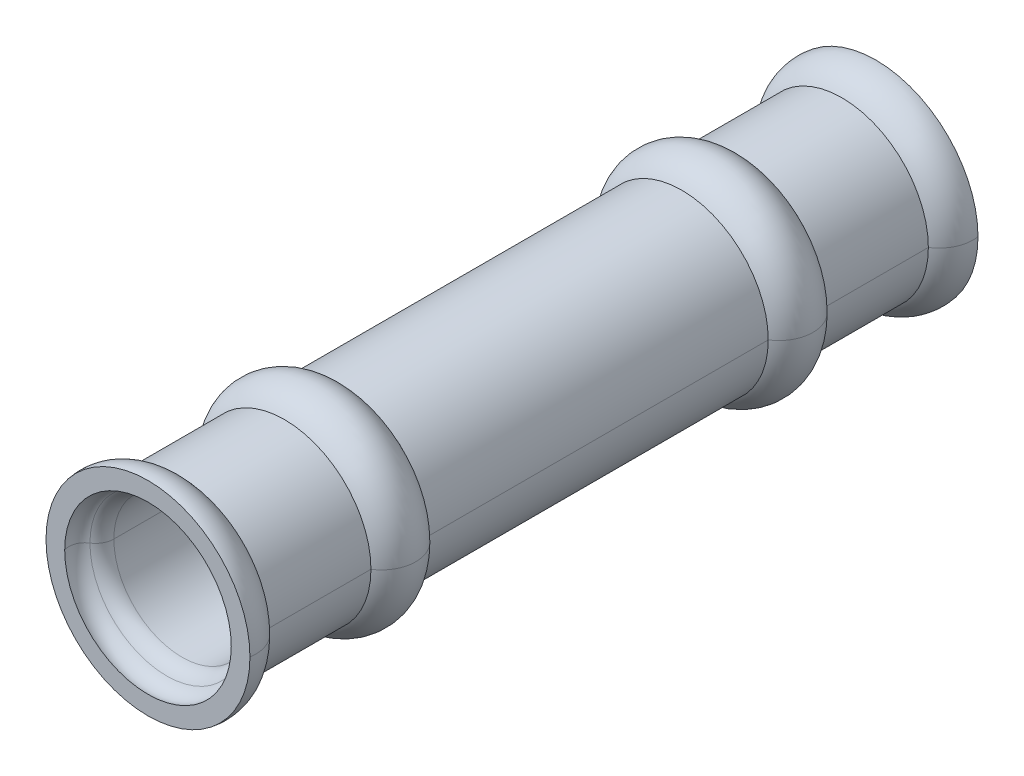
ISO-10303-21;
HEADER;
FILE_DESCRIPTION(('STEP AP214'),'2;1');
FILE_NAME('part.step','',(''),(''),'','','');
FILE_SCHEMA(('AUTOMOTIVE_DESIGN { 1 0 10303 214 1 1 1 1 }'));
ENDSEC;
DATA;
#1=APPLICATION_CONTEXT('core data for automotive mechanical design processes');
#2=APPLICATION_PROTOCOL_DEFINITION('international standard','automotive_design',2000,#1);
#3=PRODUCT_CONTEXT('',#1,'mechanical');
#4=PRODUCT('Part','Part','',(#3));
#5=PRODUCT_RELATED_PRODUCT_CATEGORY('part','',(#4));
#6=PRODUCT_DEFINITION_FORMATION('','',#4);
#7=PRODUCT_DEFINITION_CONTEXT('part definition',#1,'design');
#8=PRODUCT_DEFINITION('design','',#6,#7);
#9=PRODUCT_DEFINITION_SHAPE('','',#8);
#10=(LENGTH_UNIT() NAMED_UNIT(*) SI_UNIT(.MILLI.,.METRE.));
#11=(NAMED_UNIT(*) PLANE_ANGLE_UNIT() SI_UNIT($,.RADIAN.));
#12=(NAMED_UNIT(*) SI_UNIT($,.STERADIAN.) SOLID_ANGLE_UNIT());
#13=UNCERTAINTY_MEASURE_WITH_UNIT(LENGTH_MEASURE(1.E-05),#10,'distance_accuracy_value','');
#14=(GEOMETRIC_REPRESENTATION_CONTEXT(3) GLOBAL_UNCERTAINTY_ASSIGNED_CONTEXT((#13)) GLOBAL_UNIT_ASSIGNED_CONTEXT((#10,
#11,#12)) REPRESENTATION_CONTEXT('',''));
#15=CARTESIAN_POINT('',(0.,0.,0.));
#16=DIRECTION('',(0.,0.,1.));
#17=DIRECTION('',(1.,0.,0.));
#18=AXIS2_PLACEMENT_3D('',#15,#16,#17);
#19=CARTESIAN_POINT('',(0.,0.,-27.6));
#20=DIRECTION('',(0.,0.,-1.));
#21=DIRECTION('',(-1.,0.,0.));
#22=AXIS2_PLACEMENT_3D('',#19,#20,#21);
#23=CYLINDRICAL_SURFACE('',#22,3.);
#24=CARTESIAN_POINT('',(0.,0.,-2.53771550808997));
#25=DIRECTION('',(0.,0.,1.));
#26=DIRECTION('',(1.,0.,0.));
#27=AXIS2_PLACEMENT_3D('',#24,#25,#26);
#28=CIRCLE('',#27,3.);
#29=CARTESIAN_POINT('',(3.,0.,-2.53771550808997));
#30=VERTEX_POINT('',#29);
#31=CARTESIAN_POINT('',(-3.,0.,-2.53771550808997));
#32=VERTEX_POINT('',#31);
#33=EDGE_CURVE('E9',#30,#32,#28,.T.);
#34=ORIENTED_EDGE('',*,*,#33,.T.);
#35=DIRECTION('',(0.,0.,1.));
#36=VECTOR('',#35,1.);
#37=CARTESIAN_POINT('',(-3.,0.,-17.46228449191));
#38=LINE('',#37,#36);
#39=CARTESIAN_POINT('',(-3.,0.,-17.46228449191));
#40=VERTEX_POINT('',#39);
#41=EDGE_CURVE('E244',#40,#32,#38,.T.);
#42=ORIENTED_EDGE('',*,*,#41,.F.);
#43=CARTESIAN_POINT('',(0.,0.,-17.46228449191));
#44=DIRECTION('',(0.,0.,1.));
#45=DIRECTION('',(1.,0.,0.));
#46=AXIS2_PLACEMENT_3D('',#43,#44,#45);
#47=CIRCLE('',#46,3.);
#48=CARTESIAN_POINT('',(3.,0.,-17.46228449191));
#49=VERTEX_POINT('',#48);
#50=EDGE_CURVE('E242',#49,#40,#47,.T.);
#51=ORIENTED_EDGE('',*,*,#50,.F.);
#52=DIRECTION('',(0.,0.,1.));
#53=VECTOR('',#52,1.);
#54=CARTESIAN_POINT('',(3.,0.,-17.46228449191));
#55=LINE('',#54,#53);
#56=EDGE_CURVE('E26',#49,#30,#55,.T.);
#57=ORIENTED_EDGE('',*,*,#56,.T.);
#58=EDGE_LOOP('',(#34,#42,#51,#57));
#59=FACE_BOUND('',#58,.T.);
#60=ADVANCED_FACE('F15',(#59),#23,.F.);
#61=CARTESIAN_POINT('',(0.,0.,-2.53771550808997));
#62=DIRECTION('',(0.,0.,1.));
#63=DIRECTION('',(-1.,0.,0.));
#64=AXIS2_PLACEMENT_3D('',#61,#62,#63);
#65=TOROIDAL_SURFACE('',#64,3.8,0.8);
#66=CARTESIAN_POINT('',(0.,0.,-1.86099137259931));
#67=DIRECTION('',(0.,0.,1.));
#68=DIRECTION('',(1.,0.,0.));
#69=AXIS2_PLACEMENT_3D('',#66,#67,#68);
#70=CIRCLE('',#69,3.37333333333337);
#71=CARTESIAN_POINT('',(3.37333333333336,0.,-1.86099137259931));
#72=VERTEX_POINT('',#71);
#73=CARTESIAN_POINT('',(-3.37333333333337,0.,-1.86099137259931));
#74=VERTEX_POINT('',#73);
#75=EDGE_CURVE('E413',#72,#74,#70,.T.);
#76=ORIENTED_EDGE('',*,*,#75,.T.);
#77=CARTESIAN_POINT('',(-3.8,0.,-2.53771550808997));
#78=DIRECTION('',(0.,-1.,0.));
#79=DIRECTION('',(1.,0.,0.));
#80=AXIS2_PLACEMENT_3D('',#77,#78,#79);
#81=CIRCLE('',#80,0.8);
#82=EDGE_CURVE('E35',#32,#74,#81,.T.);
#83=ORIENTED_EDGE('',*,*,#82,.F.);
#84=ORIENTED_EDGE('',*,*,#33,.F.);
#85=CARTESIAN_POINT('',(3.8,0.,-2.53771550808997));
#86=DIRECTION('',(0.,1.,0.));
#87=DIRECTION('',(-1.,0.,0.));
#88=AXIS2_PLACEMENT_3D('',#85,#86,#87);
#89=CIRCLE('',#88,0.8);
#90=EDGE_CURVE('E362',#30,#72,#89,.T.);
#91=ORIENTED_EDGE('',*,*,#90,.T.);
#92=EDGE_LOOP('',(#76,#83,#84,#91));
#93=FACE_BOUND('',#92,.T.);
#94=ADVANCED_FACE('F851',(#93),#65,.T.);
#95=CARTESIAN_POINT('',(0.,0.,-27.6));
#96=DIRECTION('',(0.,0.,-1.));
#97=DIRECTION('',(-1.,0.,0.));
#98=AXIS2_PLACEMENT_3D('',#95,#96,#97);
#99=CYLINDRICAL_SURFACE('',#98,3.);
#100=CARTESIAN_POINT('',(0.,0.,-17.46228449191));
#101=DIRECTION('',(0.,0.,-1.));
#102=DIRECTION('',(1.,0.,0.));
#103=AXIS2_PLACEMENT_3D('',#100,#101,#102);
#104=CIRCLE('',#103,3.);
#105=EDGE_CURVE('E358',#49,#40,#104,.T.);
#106=ORIENTED_EDGE('',*,*,#105,.T.);
#107=ORIENTED_EDGE('',*,*,#41,.T.);
#108=CARTESIAN_POINT('',(0.,0.,-2.53771550808997));
#109=DIRECTION('',(0.,0.,-1.));
#110=DIRECTION('',(1.,0.,0.));
#111=AXIS2_PLACEMENT_3D('',#108,#109,#110);
#112=CIRCLE('',#111,3.);
#113=EDGE_CURVE('E219',#30,#32,#112,.T.);
#114=ORIENTED_EDGE('',*,*,#113,.F.);
#115=ORIENTED_EDGE('',*,*,#56,.F.);
#116=EDGE_LOOP('',(#106,#107,#114,#115));
#117=FACE_BOUND('',#116,.T.);
#118=ADVANCED_FACE('F453',(#117),#99,.F.);
#119=CARTESIAN_POINT('',(0.,0.,-17.46228449191));
#120=DIRECTION('',(0.,0.,1.));
#121=DIRECTION('',(-1.,0.,0.));
#122=AXIS2_PLACEMENT_3D('',#119,#120,#121);
#123=TOROIDAL_SURFACE('',#122,3.8,0.8);
#124=ORIENTED_EDGE('',*,*,#50,.T.);
#125=CARTESIAN_POINT('',(-3.8,0.,-17.46228449191));
#126=DIRECTION('',(0.,-1.,0.));
#127=DIRECTION('',(0.533333333333303,0.,-0.845905169363321));
#128=AXIS2_PLACEMENT_3D('',#125,#126,#127);
#129=CIRCLE('',#128,0.8);
#130=CARTESIAN_POINT('',(-3.37333333333336,0.,-18.1390086274007));
#131=VERTEX_POINT('',#130);
#132=EDGE_CURVE('E208',#131,#40,#129,.T.);
#133=ORIENTED_EDGE('',*,*,#132,.F.);
#134=CARTESIAN_POINT('',(0.,0.,-18.1390086274007));
#135=DIRECTION('',(0.,0.,1.));
#136=DIRECTION('',(1.,0.,0.));
#137=AXIS2_PLACEMENT_3D('',#134,#135,#136);
#138=CIRCLE('',#137,3.37333333333336);
#139=CARTESIAN_POINT('',(3.37333333333336,0.,-18.1390086274007));
#140=VERTEX_POINT('',#139);
#141=EDGE_CURVE('E213',#140,#131,#138,.T.);
#142=ORIENTED_EDGE('',*,*,#141,.F.);
#143=CARTESIAN_POINT('',(3.8,0.,-17.46228449191));
#144=DIRECTION('',(0.,1.,0.));
#145=DIRECTION('',(-0.533333333333303,0.,-0.845905169363321));
#146=AXIS2_PLACEMENT_3D('',#143,#144,#145);
#147=CIRCLE('',#146,0.8);
#148=EDGE_CURVE('E241',#140,#49,#147,.T.);
#149=ORIENTED_EDGE('',*,*,#148,.T.);
#150=EDGE_LOOP('',(#124,#133,#142,#149));
#151=FACE_BOUND('',#150,.T.);
#152=ADVANCED_FACE('F497',(#151),#123,.T.);
#153=CARTESIAN_POINT('',(0.,0.,-1.26885775404498));
#154=DIRECTION('',(0.,0.,1.));
#155=DIRECTION('',(-1.,0.,0.));
#156=AXIS2_PLACEMENT_3D('',#153,#154,#155);
#157=TOROIDAL_SURFACE('',#156,3.00000000000006,0.7);
#158=CARTESIAN_POINT('',(0.,0.,-0.676724135490659));
#159=DIRECTION('',(0.,0.,1.));
#160=DIRECTION('',(1.,0.,0.));
#161=AXIS2_PLACEMENT_3D('',#158,#159,#160);
#162=CIRCLE('',#161,3.37333333333337);
#163=CARTESIAN_POINT('',(3.37333333333337,0.,-0.676724135490658));
#164=VERTEX_POINT('',#163);
#165=CARTESIAN_POINT('',(-3.37333333333337,0.,-0.676724135490659));
#166=VERTEX_POINT('',#165);
#167=EDGE_CURVE('E218',#164,#166,#162,.T.);
#168=ORIENTED_EDGE('',*,*,#167,.T.);
#169=CARTESIAN_POINT('',(-3.00000000000006,0.,-1.26885775404498));
#170=DIRECTION('',(0.,1.,0.));
#171=DIRECTION('',(-0.533333333333298,0.,-0.845905169363324));
#172=AXIS2_PLACEMENT_3D('',#169,#170,#171);
#173=CIRCLE('',#172,0.7);
#174=EDGE_CURVE('E346',#74,#166,#173,.T.);
#175=ORIENTED_EDGE('',*,*,#174,.F.);
#176=ORIENTED_EDGE('',*,*,#75,.F.);
#177=CARTESIAN_POINT('',(3.00000000000006,0.,-1.26885775404498));
#178=DIRECTION('',(0.,-1.,0.));
#179=DIRECTION('',(0.533333333333298,0.,-0.845905169363324));
#180=AXIS2_PLACEMENT_3D('',#177,#178,#179);
#181=CIRCLE('',#180,0.7);
#182=EDGE_CURVE('E214',#72,#164,#181,.T.);
#183=ORIENTED_EDGE('',*,*,#182,.T.);
#184=EDGE_LOOP('',(#168,#175,#176,#183));
#185=FACE_BOUND('',#184,.T.);
#186=ADVANCED_FACE('F1251',(#185),#157,.F.);
#187=CARTESIAN_POINT('',(0.,0.,-2.53771550808997));
#188=DIRECTION('',(0.,0.,1.));
#189=DIRECTION('',(-1.,0.,0.));
#190=AXIS2_PLACEMENT_3D('',#187,#188,#189);
#191=TOROIDAL_SURFACE('',#190,3.8,0.8);
#192=ORIENTED_EDGE('',*,*,#113,.T.);
#193=ORIENTED_EDGE('',*,*,#82,.T.);
#194=CARTESIAN_POINT('',(0.,0.,-1.86099137259931));
#195=DIRECTION('',(0.,0.,-1.));
#196=DIRECTION('',(1.,0.,0.));
#197=AXIS2_PLACEMENT_3D('',#194,#195,#196);
#198=CIRCLE('',#197,3.37333333333337);
#199=EDGE_CURVE('E350',#72,#74,#198,.T.);
#200=ORIENTED_EDGE('',*,*,#199,.F.);
#201=ORIENTED_EDGE('',*,*,#90,.F.);
#202=EDGE_LOOP('',(#192,#193,#200,#201));
#203=FACE_BOUND('',#202,.T.);
#204=ADVANCED_FACE('F461',(#203),#191,.T.);
#205=CARTESIAN_POINT('',(0.,0.,-17.46228449191));
#206=DIRECTION('',(0.,0.,1.));
#207=DIRECTION('',(-1.,0.,0.));
#208=AXIS2_PLACEMENT_3D('',#205,#206,#207);
#209=TOROIDAL_SURFACE('',#208,3.8,0.8);
#210=CARTESIAN_POINT('',(0.,0.,-18.1390086274007));
#211=DIRECTION('',(0.,0.,-1.));
#212=DIRECTION('',(1.,0.,0.));
#213=AXIS2_PLACEMENT_3D('',#210,#211,#212);
#214=CIRCLE('',#213,3.37333333333336);
#215=EDGE_CURVE('E212',#140,#131,#214,.T.);
#216=ORIENTED_EDGE('',*,*,#215,.T.);
#217=ORIENTED_EDGE('',*,*,#132,.T.);
#218=ORIENTED_EDGE('',*,*,#105,.F.);
#219=ORIENTED_EDGE('',*,*,#148,.F.);
#220=EDGE_LOOP('',(#216,#217,#218,#219));
#221=FACE_BOUND('',#220,.T.);
#222=ADVANCED_FACE('F501',(#221),#209,.T.);
#223=CARTESIAN_POINT('',(0.,0.,-18.731142245955));
#224=DIRECTION('',(0.,0.,1.));
#225=DIRECTION('',(-1.,0.,0.));
#226=AXIS2_PLACEMENT_3D('',#223,#224,#225);
#227=TOROIDAL_SURFACE('',#226,3.00000000000006,0.7);
#228=ORIENTED_EDGE('',*,*,#141,.T.);
#229=CARTESIAN_POINT('',(-3.00000000000006,0.,-18.731142245955));
#230=DIRECTION('',(0.,1.,0.));
#231=DIRECTION('',(-0.533333333333301,0.,-0.845905169363322));
#232=AXIS2_PLACEMENT_3D('',#229,#230,#231);
#233=CIRCLE('',#232,0.7);
#234=CARTESIAN_POINT('',(-3.37333333333337,0.,-19.3232758645094));
#235=VERTEX_POINT('',#234);
#236=EDGE_CURVE('E307',#235,#131,#233,.T.);
#237=ORIENTED_EDGE('',*,*,#236,.F.);
#238=CARTESIAN_POINT('',(0.,0.,-19.3232758645094));
#239=DIRECTION('',(0.,0.,1.));
#240=DIRECTION('',(1.,0.,0.));
#241=AXIS2_PLACEMENT_3D('',#238,#239,#240);
#242=CIRCLE('',#241,3.37333333333337);
#243=CARTESIAN_POINT('',(3.37333333333337,0.,-19.3232758645094));
#244=VERTEX_POINT('',#243);
#245=EDGE_CURVE('E311',#244,#235,#242,.T.);
#246=ORIENTED_EDGE('',*,*,#245,.F.);
#247=CARTESIAN_POINT('',(3.00000000000006,0.,-18.731142245955));
#248=DIRECTION('',(0.,-1.,0.));
#249=DIRECTION('',(0.533333333333301,0.,-0.845905169363322));
#250=AXIS2_PLACEMENT_3D('',#247,#248,#249);
#251=CIRCLE('',#250,0.7);
#252=EDGE_CURVE('E206',#244,#140,#251,.T.);
#253=ORIENTED_EDGE('',*,*,#252,.T.);
#254=EDGE_LOOP('',(#228,#237,#246,#253));
#255=FACE_BOUND('',#254,.T.);
#256=ADVANCED_FACE('F505',(#255),#227,.F.);
#257=CARTESIAN_POINT('',(0.,0.,0.));
#258=DIRECTION('',(0.,0.,1.));
#259=DIRECTION('',(-1.,0.,0.));
#260=AXIS2_PLACEMENT_3D('',#257,#258,#259);
#261=TOROIDAL_SURFACE('',#260,3.8,0.8);
#262=CARTESIAN_POINT('',(0.,0.,0.));
#263=DIRECTION('',(0.,0.,1.));
#264=DIRECTION('',(1.,0.,0.));
#265=AXIS2_PLACEMENT_3D('',#262,#263,#264);
#266=CIRCLE('',#265,3.);
#267=CARTESIAN_POINT('',(3.,0.,0.));
#268=VERTEX_POINT('',#267);
#269=CARTESIAN_POINT('',(-3.,0.,0.));
#270=VERTEX_POINT('',#269);
#271=EDGE_CURVE('E202',#268,#270,#266,.T.);
#272=ORIENTED_EDGE('',*,*,#271,.T.);
#273=CARTESIAN_POINT('',(-3.8,0.,0.));
#274=DIRECTION('',(0.,-1.,0.));
#275=DIRECTION('',(0.533333333333298,0.,-0.845905169363324));
#276=AXIS2_PLACEMENT_3D('',#273,#274,#275);
#277=CIRCLE('',#276,0.8);
#278=EDGE_CURVE('E225',#166,#270,#277,.T.);
#279=ORIENTED_EDGE('',*,*,#278,.F.);
#280=ORIENTED_EDGE('',*,*,#167,.F.);
#281=CARTESIAN_POINT('',(3.8,0.,0.));
#282=DIRECTION('',(0.,1.,0.));
#283=DIRECTION('',(-0.533333333333297,0.,-0.845905169363324));
#284=AXIS2_PLACEMENT_3D('',#281,#282,#283);
#285=CIRCLE('',#284,0.8);
#286=EDGE_CURVE('E207',#164,#268,#285,.T.);
#287=ORIENTED_EDGE('',*,*,#286,.T.);
#288=EDGE_LOOP('',(#272,#279,#280,#287));
#289=FACE_BOUND('',#288,.T.);
#290=ADVANCED_FACE('F867',(#289),#261,.T.);
#291=CARTESIAN_POINT('',(0.,0.,-1.26885775404498));
#292=DIRECTION('',(0.,0.,1.));
#293=DIRECTION('',(-1.,0.,0.));
#294=AXIS2_PLACEMENT_3D('',#291,#292,#293);
#295=TOROIDAL_SURFACE('',#294,3.00000000000006,0.7);
#296=ORIENTED_EDGE('',*,*,#199,.T.);
#297=ORIENTED_EDGE('',*,*,#174,.T.);
#298=CARTESIAN_POINT('',(0.,0.,-0.676724135490659));
#299=DIRECTION('',(0.,0.,-1.));
#300=DIRECTION('',(1.,0.,0.));
#301=AXIS2_PLACEMENT_3D('',#298,#299,#300);
#302=CIRCLE('',#301,3.37333333333337);
#303=EDGE_CURVE('E220',#164,#166,#302,.T.);
#304=ORIENTED_EDGE('',*,*,#303,.F.);
#305=ORIENTED_EDGE('',*,*,#182,.F.);
#306=EDGE_LOOP('',(#296,#297,#304,#305));
#307=FACE_BOUND('',#306,.T.);
#308=ADVANCED_FACE('F892',(#307),#295,.F.);
#309=CARTESIAN_POINT('',(0.,0.,-18.731142245955));
#310=DIRECTION('',(0.,0.,1.));
#311=DIRECTION('',(-1.,0.,0.));
#312=AXIS2_PLACEMENT_3D('',#309,#310,#311);
#313=TOROIDAL_SURFACE('',#312,3.00000000000006,0.7);
#314=CARTESIAN_POINT('',(0.,0.,-19.3232758645094));
#315=DIRECTION('',(0.,0.,-1.));
#316=DIRECTION('',(1.,0.,0.));
#317=AXIS2_PLACEMENT_3D('',#314,#315,#316);
#318=CIRCLE('',#317,3.37333333333337);
#319=EDGE_CURVE('E310',#244,#235,#318,.T.);
#320=ORIENTED_EDGE('',*,*,#319,.T.);
#321=ORIENTED_EDGE('',*,*,#236,.T.);
#322=ORIENTED_EDGE('',*,*,#215,.F.);
#323=ORIENTED_EDGE('',*,*,#252,.F.);
#324=EDGE_LOOP('',(#320,#321,#322,#323));
#325=FACE_BOUND('',#324,.T.);
#326=ADVANCED_FACE('F509',(#325),#313,.F.);
#327=CARTESIAN_POINT('',(0.,0.,-20.));
#328=DIRECTION('',(0.,0.,1.));
#329=DIRECTION('',(-1.,0.,0.));
#330=AXIS2_PLACEMENT_3D('',#327,#328,#329);
#331=TOROIDAL_SURFACE('',#330,3.8,0.8);
#332=ORIENTED_EDGE('',*,*,#245,.T.);
#333=CARTESIAN_POINT('',(-3.8,0.,-20.));
#334=DIRECTION('',(0.,-1.,0.));
#335=DIRECTION('',(1.,0.,0.));
#336=AXIS2_PLACEMENT_3D('',#333,#334,#335);
#337=CIRCLE('',#336,0.8);
#338=CARTESIAN_POINT('',(-3.,0.,-20.));
#339=VERTEX_POINT('',#338);
#340=EDGE_CURVE('E246',#339,#235,#337,.T.);
#341=ORIENTED_EDGE('',*,*,#340,.F.);
#342=CARTESIAN_POINT('',(0.,0.,-20.));
#343=DIRECTION('',(0.,0.,1.));
#344=DIRECTION('',(1.,0.,0.));
#345=AXIS2_PLACEMENT_3D('',#342,#343,#344);
#346=CIRCLE('',#345,3.);
#347=CARTESIAN_POINT('',(3.,0.,-20.));
#348=VERTEX_POINT('',#347);
#349=EDGE_CURVE('E251',#348,#339,#346,.T.);
#350=ORIENTED_EDGE('',*,*,#349,.F.);
#351=CARTESIAN_POINT('',(3.8,0.,-20.));
#352=DIRECTION('',(0.,1.,0.));
#353=DIRECTION('',(-1.,0.,0.));
#354=AXIS2_PLACEMENT_3D('',#351,#352,#353);
#355=CIRCLE('',#354,0.8);
#356=EDGE_CURVE('E444',#348,#244,#355,.T.);
#357=ORIENTED_EDGE('',*,*,#356,.T.);
#358=EDGE_LOOP('',(#332,#341,#350,#357));
#359=FACE_BOUND('',#358,.T.);
#360=ADVANCED_FACE('F513',(#359),#331,.T.);
#361=CARTESIAN_POINT('',(0.,0.,-27.6));
#362=DIRECTION('',(0.,0.,-1.));
#363=DIRECTION('',(-1.,0.,0.));
#364=AXIS2_PLACEMENT_3D('',#361,#362,#363);
#365=CYLINDRICAL_SURFACE('',#364,3.);
#366=CARTESIAN_POINT('',(0.,0.,4.5));
#367=DIRECTION('',(0.,0.,1.));
#368=DIRECTION('',(1.,0.,0.));
#369=AXIS2_PLACEMENT_3D('',#366,#367,#368);
#370=CIRCLE('',#369,3.);
#371=CARTESIAN_POINT('',(3.,0.,4.5));
#372=VERTEX_POINT('',#371);
#373=CARTESIAN_POINT('',(-3.,0.,4.5));
#374=VERTEX_POINT('',#373);
#375=EDGE_CURVE('E171',#372,#374,#370,.T.);
#376=ORIENTED_EDGE('',*,*,#375,.T.);
#377=DIRECTION('',(0.,0.,1.));
#378=VECTOR('',#377,1.);
#379=CARTESIAN_POINT('',(-3.,0.,0.));
#380=LINE('',#379,#378);
#381=EDGE_CURVE('E230',#270,#374,#380,.T.);
#382=ORIENTED_EDGE('',*,*,#381,.F.);
#383=ORIENTED_EDGE('',*,*,#271,.F.);
#384=DIRECTION('',(0.,0.,1.));
#385=VECTOR('',#384,1.);
#386=CARTESIAN_POINT('',(3.,0.,0.));
#387=LINE('',#386,#385);
#388=EDGE_CURVE('E224',#268,#372,#387,.T.);
#389=ORIENTED_EDGE('',*,*,#388,.T.);
#390=EDGE_LOOP('',(#376,#382,#383,#389));
#391=FACE_BOUND('',#390,.T.);
#392=ADVANCED_FACE('F872',(#391),#365,.F.);
#393=CARTESIAN_POINT('',(0.,0.,0.));
#394=DIRECTION('',(0.,0.,1.));
#395=DIRECTION('',(-1.,0.,0.));
#396=AXIS2_PLACEMENT_3D('',#393,#394,#395);
#397=TOROIDAL_SURFACE('',#396,3.8,0.8);
#398=ORIENTED_EDGE('',*,*,#303,.T.);
#399=ORIENTED_EDGE('',*,*,#278,.T.);
#400=CARTESIAN_POINT('',(0.,0.,0.));
#401=DIRECTION('',(0.,0.,-1.));
#402=DIRECTION('',(1.,0.,0.));
#403=AXIS2_PLACEMENT_3D('',#400,#401,#402);
#404=CIRCLE('',#403,3.);
#405=EDGE_CURVE('E19',#268,#270,#404,.T.);
#406=ORIENTED_EDGE('',*,*,#405,.F.);
#407=ORIENTED_EDGE('',*,*,#286,.F.);
#408=EDGE_LOOP('',(#398,#399,#406,#407));
#409=FACE_BOUND('',#408,.T.);
#410=ADVANCED_FACE('F1164',(#409),#397,.T.);
#411=CARTESIAN_POINT('',(0.,0.,-20.));
#412=DIRECTION('',(0.,0.,1.));
#413=DIRECTION('',(-1.,0.,0.));
#414=AXIS2_PLACEMENT_3D('',#411,#412,#413);
#415=TOROIDAL_SURFACE('',#414,3.8,0.8);
#416=CARTESIAN_POINT('',(0.,0.,-20.));
#417=DIRECTION('',(0.,0.,-1.));
#418=DIRECTION('',(1.,0.,0.));
#419=AXIS2_PLACEMENT_3D('',#416,#417,#418);
#420=CIRCLE('',#419,3.);
#421=EDGE_CURVE('E250',#348,#339,#420,.T.);
#422=ORIENTED_EDGE('',*,*,#421,.T.);
#423=ORIENTED_EDGE('',*,*,#340,.T.);
#424=ORIENTED_EDGE('',*,*,#319,.F.);
#425=ORIENTED_EDGE('',*,*,#356,.F.);
#426=EDGE_LOOP('',(#422,#423,#424,#425));
#427=FACE_BOUND('',#426,.T.);
#428=ADVANCED_FACE('F517',(#427),#415,.T.);
#429=CARTESIAN_POINT('',(0.,0.,-27.6));
#430=DIRECTION('',(0.,0.,-1.));
#431=DIRECTION('',(-1.,0.,0.));
#432=AXIS2_PLACEMENT_3D('',#429,#430,#431);
#433=CYLINDRICAL_SURFACE('',#432,3.);
#434=ORIENTED_EDGE('',*,*,#349,.T.);
#435=DIRECTION('',(0.,0.,1.));
#436=VECTOR('',#435,1.);
#437=CARTESIAN_POINT('',(-3.,0.,-24.5));
#438=LINE('',#437,#436);
#439=CARTESIAN_POINT('',(-3.,0.,-24.5));
#440=VERTEX_POINT('',#439);
#441=EDGE_CURVE('E231',#440,#339,#438,.T.);
#442=ORIENTED_EDGE('',*,*,#441,.F.);
#443=CARTESIAN_POINT('',(0.,0.,-24.5));
#444=DIRECTION('',(0.,0.,1.));
#445=DIRECTION('',(1.,0.,0.));
#446=AXIS2_PLACEMENT_3D('',#443,#444,#445);
#447=CIRCLE('',#446,3.);
#448=CARTESIAN_POINT('',(3.,0.,-24.5));
#449=VERTEX_POINT('',#448);
#450=EDGE_CURVE('E292',#449,#440,#447,.T.);
#451=ORIENTED_EDGE('',*,*,#450,.F.);
#452=DIRECTION('',(0.,0.,1.));
#453=VECTOR('',#452,1.);
#454=CARTESIAN_POINT('',(3.,0.,-24.5));
#455=LINE('',#454,#453);
#456=EDGE_CURVE('E182',#449,#348,#455,.T.);
#457=ORIENTED_EDGE('',*,*,#456,.T.);
#458=EDGE_LOOP('',(#434,#442,#451,#457));
#459=FACE_BOUND('',#458,.T.);
#460=ADVANCED_FACE('F520',(#459),#433,.F.);
#461=CARTESIAN_POINT('',(0.,0.,4.5));
#462=DIRECTION('',(0.,0.,1.));
#463=DIRECTION('',(-1.,0.,0.));
#464=AXIS2_PLACEMENT_3D('',#461,#462,#463);
#465=TOROIDAL_SURFACE('',#464,3.8,0.8);
#466=CARTESIAN_POINT('',(0.,0.,5.17672413549066));
#467=DIRECTION('',(0.,0.,1.));
#468=DIRECTION('',(1.,0.,0.));
#469=AXIS2_PLACEMENT_3D('',#466,#467,#468);
#470=CIRCLE('',#469,3.37333333333337);
#471=CARTESIAN_POINT('',(3.37333333333337,0.,5.17672413549066));
#472=VERTEX_POINT('',#471);
#473=CARTESIAN_POINT('',(-3.37333333333337,0.,5.17672413549066));
#474=VERTEX_POINT('',#473);
#475=EDGE_CURVE('E169',#472,#474,#470,.T.);
#476=ORIENTED_EDGE('',*,*,#475,.T.);
#477=CARTESIAN_POINT('',(-3.8,0.,4.5));
#478=DIRECTION('',(0.,-1.,0.));
#479=DIRECTION('',(1.,0.,0.));
#480=AXIS2_PLACEMENT_3D('',#477,#478,#479);
#481=CIRCLE('',#480,0.8);
#482=EDGE_CURVE('E185',#374,#474,#481,.T.);
#483=ORIENTED_EDGE('',*,*,#482,.F.);
#484=ORIENTED_EDGE('',*,*,#375,.F.);
#485=CARTESIAN_POINT('',(3.8,0.,4.5));
#486=DIRECTION('',(0.,1.,0.));
#487=DIRECTION('',(-1.,0.,0.));
#488=AXIS2_PLACEMENT_3D('',#485,#486,#487);
#489=CIRCLE('',#488,0.8);
#490=EDGE_CURVE('E167',#372,#472,#489,.T.);
#491=ORIENTED_EDGE('',*,*,#490,.T.);
#492=EDGE_LOOP('',(#476,#483,#484,#491));
#493=FACE_BOUND('',#492,.T.);
#494=ADVANCED_FACE('F168',(#493),#465,.T.);
#495=CARTESIAN_POINT('',(0.,0.,-27.6));
#496=DIRECTION('',(0.,0.,-1.));
#497=DIRECTION('',(-1.,0.,0.));
#498=AXIS2_PLACEMENT_3D('',#495,#496,#497);
#499=CYLINDRICAL_SURFACE('',#498,3.);
#500=ORIENTED_EDGE('',*,*,#405,.T.);
#501=ORIENTED_EDGE('',*,*,#381,.T.);
#502=CARTESIAN_POINT('',(0.,0.,4.5));
#503=DIRECTION('',(0.,0.,-1.));
#504=DIRECTION('',(1.,0.,0.));
#505=AXIS2_PLACEMENT_3D('',#502,#503,#504);
#506=CIRCLE('',#505,3.);
#507=EDGE_CURVE('E162',#372,#374,#506,.T.);
#508=ORIENTED_EDGE('',*,*,#507,.F.);
#509=ORIENTED_EDGE('',*,*,#388,.F.);
#510=EDGE_LOOP('',(#500,#501,#508,#509));
#511=FACE_BOUND('',#510,.T.);
#512=ADVANCED_FACE('F1122',(#511),#499,.F.);
#513=CARTESIAN_POINT('',(0.,0.,-27.6));
#514=DIRECTION('',(0.,0.,-1.));
#515=DIRECTION('',(-1.,0.,0.));
#516=AXIS2_PLACEMENT_3D('',#513,#514,#515);
#517=CYLINDRICAL_SURFACE('',#516,3.);
#518=CARTESIAN_POINT('',(0.,0.,-24.5));
#519=DIRECTION('',(0.,0.,-1.));
#520=DIRECTION('',(1.,0.,0.));
#521=AXIS2_PLACEMENT_3D('',#518,#519,#520);
#522=CIRCLE('',#521,3.);
#523=EDGE_CURVE('E226',#449,#440,#522,.T.);
#524=ORIENTED_EDGE('',*,*,#523,.T.);
#525=ORIENTED_EDGE('',*,*,#441,.T.);
#526=ORIENTED_EDGE('',*,*,#421,.F.);
#527=ORIENTED_EDGE('',*,*,#456,.F.);
#528=EDGE_LOOP('',(#524,#525,#526,#527));
#529=FACE_BOUND('',#528,.T.);
#530=ADVANCED_FACE('F525',(#529),#517,.F.);
#531=CARTESIAN_POINT('',(0.,0.,-24.5));
#532=DIRECTION('',(0.,0.,1.));
#533=DIRECTION('',(-1.,0.,0.));
#534=AXIS2_PLACEMENT_3D('',#531,#532,#533);
#535=TOROIDAL_SURFACE('',#534,3.8,0.8);
#536=ORIENTED_EDGE('',*,*,#450,.T.);
#537=CARTESIAN_POINT('',(-3.8,0.,-24.5));
#538=DIRECTION('',(0.,-1.,0.));
#539=DIRECTION('',(0.533333333333297,0.,-0.845905169363324));
#540=AXIS2_PLACEMENT_3D('',#537,#538,#539);
#541=CIRCLE('',#540,0.799999999999991);
#542=CARTESIAN_POINT('',(-3.37333333333336,0.,-25.1767241354906));
#543=VERTEX_POINT('',#542);
#544=EDGE_CURVE('E326',#543,#440,#541,.T.);
#545=ORIENTED_EDGE('',*,*,#544,.F.);
#546=CARTESIAN_POINT('',(0.,0.,-25.1767241354906));
#547=DIRECTION('',(0.,0.,1.));
#548=DIRECTION('',(1.,0.,0.));
#549=AXIS2_PLACEMENT_3D('',#546,#547,#548);
#550=CIRCLE('',#549,3.37333333333337);
#551=CARTESIAN_POINT('',(3.37333333333337,0.,-25.1767241354906));
#552=VERTEX_POINT('',#551);
#553=EDGE_CURVE('E380',#552,#543,#550,.T.);
#554=ORIENTED_EDGE('',*,*,#553,.F.);
#555=CARTESIAN_POINT('',(3.8,0.,-24.5));
#556=DIRECTION('',(0.,1.,0.));
#557=DIRECTION('',(-0.533333333333297,0.,-0.845905169363324));
#558=AXIS2_PLACEMENT_3D('',#555,#556,#557);
#559=CIRCLE('',#558,0.799999999999991);
#560=EDGE_CURVE('E402',#552,#449,#559,.T.);
#561=ORIENTED_EDGE('',*,*,#560,.T.);
#562=EDGE_LOOP('',(#536,#545,#554,#561));
#563=FACE_BOUND('',#562,.T.);
#564=ADVANCED_FACE('F528',(#563),#535,.T.);
#565=CARTESIAN_POINT('',(0.,0.,5.76885775404498));
#566=DIRECTION('',(0.,0.,1.));
#567=DIRECTION('',(-1.,0.,0.));
#568=AXIS2_PLACEMENT_3D('',#565,#566,#567);
#569=TOROIDAL_SURFACE('',#568,3.00000000000006,0.7);
#570=CARTESIAN_POINT('',(0.,0.,6.));
#571=DIRECTION('',(0.,0.,1.));
#572=DIRECTION('',(1.,0.,0.));
#573=AXIS2_PLACEMENT_3D('',#570,#571,#572);
#574=CIRCLE('',#573,3.6607369084098);
#575=CARTESIAN_POINT('',(3.6607369084098,0.,6.));
#576=VERTEX_POINT('',#575);
#577=CARTESIAN_POINT('',(-3.66073690840981,0.,6.));
#578=VERTEX_POINT('',#577);
#579=EDGE_CURVE('E161',#576,#578,#574,.T.);
#580=ORIENTED_EDGE('',*,*,#579,.T.);
#581=CARTESIAN_POINT('',(-3.00000000000006,0.,5.76885775404498));
#582=DIRECTION('',(0.,1.,0.));
#583=DIRECTION('',(-0.533333333333304,0.,-0.84590516936332));
#584=AXIS2_PLACEMENT_3D('',#581,#582,#583);
#585=CIRCLE('',#584,0.7);
#586=EDGE_CURVE('E179',#474,#578,#585,.T.);
#587=ORIENTED_EDGE('',*,*,#586,.F.);
#588=ORIENTED_EDGE('',*,*,#475,.F.);
#589=CARTESIAN_POINT('',(3.00000000000005,0.,5.76885775404498));
#590=DIRECTION('',(0.,-1.,0.));
#591=DIRECTION('',(0.533333333333304,0.,-0.84590516936332));
#592=AXIS2_PLACEMENT_3D('',#589,#590,#591);
#593=CIRCLE('',#592,0.7);
#594=EDGE_CURVE('E148',#472,#576,#593,.T.);
#595=ORIENTED_EDGE('',*,*,#594,.T.);
#596=EDGE_LOOP('',(#580,#587,#588,#595));
#597=FACE_BOUND('',#596,.T.);
#598=ADVANCED_FACE('F178',(#597),#569,.F.);
#599=CARTESIAN_POINT('',(0.,0.,4.5));
#600=DIRECTION('',(0.,0.,1.));
#601=DIRECTION('',(-1.,0.,0.));
#602=AXIS2_PLACEMENT_3D('',#599,#600,#601);
#603=TOROIDAL_SURFACE('',#602,3.8,0.8);
#604=ORIENTED_EDGE('',*,*,#507,.T.);
#605=ORIENTED_EDGE('',*,*,#482,.T.);
#606=CARTESIAN_POINT('',(0.,0.,5.17672413549066));
#607=DIRECTION('',(0.,0.,-1.));
#608=DIRECTION('',(1.,0.,0.));
#609=AXIS2_PLACEMENT_3D('',#606,#607,#608);
#610=CIRCLE('',#609,3.37333333333337);
#611=EDGE_CURVE('E153',#472,#474,#610,.T.);
#612=ORIENTED_EDGE('',*,*,#611,.F.);
#613=ORIENTED_EDGE('',*,*,#490,.F.);
#614=EDGE_LOOP('',(#604,#605,#612,#613));
#615=FACE_BOUND('',#614,.T.);
#616=ADVANCED_FACE('F184',(#615),#603,.T.);
#617=CARTESIAN_POINT('',(0.,0.,-24.5));
#618=DIRECTION('',(0.,0.,1.));
#619=DIRECTION('',(-1.,0.,0.));
#620=AXIS2_PLACEMENT_3D('',#617,#618,#619);
#621=TOROIDAL_SURFACE('',#620,3.8,0.8);
#622=CARTESIAN_POINT('',(0.,0.,-25.1767241354906));
#623=DIRECTION('',(0.,0.,-1.));
#624=DIRECTION('',(1.,0.,0.));
#625=AXIS2_PLACEMENT_3D('',#622,#623,#624);
#626=CIRCLE('',#625,3.37333333333337);
#627=EDGE_CURVE('E322',#552,#543,#626,.T.);
#628=ORIENTED_EDGE('',*,*,#627,.T.);
#629=ORIENTED_EDGE('',*,*,#544,.T.);
#630=ORIENTED_EDGE('',*,*,#523,.F.);
#631=ORIENTED_EDGE('',*,*,#560,.F.);
#632=EDGE_LOOP('',(#628,#629,#630,#631));
#633=FACE_BOUND('',#632,.T.);
#634=ADVANCED_FACE('F845',(#633),#621,.T.);
#635=CARTESIAN_POINT('',(0.,0.,-25.768857754045));
#636=DIRECTION('',(0.,0.,1.));
#637=DIRECTION('',(-1.,0.,0.));
#638=AXIS2_PLACEMENT_3D('',#635,#636,#637);
#639=TOROIDAL_SURFACE('',#638,3.00000000000005,0.7);
#640=ORIENTED_EDGE('',*,*,#553,.T.);
#641=CARTESIAN_POINT('',(-3.00000000000006,0.,-25.768857754045));
#642=DIRECTION('',(0.,1.,0.));
#643=DIRECTION('',(-0.943909869156778,0.,-0.330203208507178));
#644=AXIS2_PLACEMENT_3D('',#641,#642,#643);
#645=CIRCLE('',#644,0.7);
#646=CARTESIAN_POINT('',(-3.6607369084098,0.,-26.));
#647=VERTEX_POINT('',#646);
#648=EDGE_CURVE('E313',#647,#543,#645,.T.);
#649=ORIENTED_EDGE('',*,*,#648,.F.);
#650=CARTESIAN_POINT('',(0.,0.,-26.));
#651=DIRECTION('',(0.,0.,1.));
#652=DIRECTION('',(1.,0.,0.));
#653=AXIS2_PLACEMENT_3D('',#650,#651,#652);
#654=CIRCLE('',#653,3.6607369084098);
#655=CARTESIAN_POINT('',(3.6607369084098,0.,-26.));
#656=VERTEX_POINT('',#655);
#657=EDGE_CURVE('E281',#656,#647,#654,.T.);
#658=ORIENTED_EDGE('',*,*,#657,.F.);
#659=CARTESIAN_POINT('',(3.00000000000006,0.,-25.768857754045));
#660=DIRECTION('',(0.,-1.,0.));
#661=DIRECTION('',(0.943909869156778,0.,-0.330203208507178));
#662=AXIS2_PLACEMENT_3D('',#659,#660,#661);
#663=CIRCLE('',#662,0.7);
#664=EDGE_CURVE('E306',#656,#552,#663,.T.);
#665=ORIENTED_EDGE('',*,*,#664,.T.);
#666=EDGE_LOOP('',(#640,#649,#658,#665));
#667=FACE_BOUND('',#666,.T.);
#668=ADVANCED_FACE('F835',(#667),#639,.F.);
#669=CARTESIAN_POINT('',(0.,0.,6.));
#670=DIRECTION('',(0.,0.,1.));
#671=DIRECTION('',(-1.,0.,0.));
#672=AXIS2_PLACEMENT_3D('',#669,#670,#671);
#673=PLANE('',#672);
#674=ORIENTED_EDGE('',*,*,#579,.F.);
#675=CARTESIAN_POINT('',(0.,0.,6.));
#676=DIRECTION('',(0.,0.,-1.));
#677=DIRECTION('',(1.,0.,0.));
#678=AXIS2_PLACEMENT_3D('',#675,#676,#677);
#679=CIRCLE('',#678,3.6607369084098);
#680=EDGE_CURVE('E155',#576,#578,#679,.T.);
#681=ORIENTED_EDGE('',*,*,#680,.T.);
#682=EDGE_LOOP('',(#674,#681));
#683=FACE_BOUND('',#682,.T.);
#684=CARTESIAN_POINT('',(0.,0.,6.));
#685=DIRECTION('',(0.,0.,-1.));
#686=DIRECTION('',(1.,0.,0.));
#687=AXIS2_PLACEMENT_3D('',#684,#685,#686);
#688=CIRCLE('',#687,4.48208409415089);
#689=CARTESIAN_POINT('',(4.48208409415088,0.,6.));
#690=VERTEX_POINT('',#689);
#691=CARTESIAN_POINT('',(-4.48208409415089,0.,6.));
#692=VERTEX_POINT('',#691);
#693=EDGE_CURVE('E285',#690,#692,#688,.T.);
#694=ORIENTED_EDGE('',*,*,#693,.F.);
#695=CARTESIAN_POINT('',(0.,0.,6.));
#696=DIRECTION('',(0.,0.,1.));
#697=DIRECTION('',(1.,0.,0.));
#698=AXIS2_PLACEMENT_3D('',#695,#696,#697);
#699=CIRCLE('',#698,4.48208409415088);
#700=EDGE_CURVE('E187',#690,#692,#699,.T.);
#701=ORIENTED_EDGE('',*,*,#700,.T.);
#702=EDGE_LOOP('',(#694,#701));
#703=FACE_BOUND('',#702,.T.);
#704=ADVANCED_FACE('F833',(#683,#703),#673,.T.);
#705=CARTESIAN_POINT('',(0.,0.,5.76885775404498));
#706=DIRECTION('',(0.,0.,1.));
#707=DIRECTION('',(-1.,0.,0.));
#708=AXIS2_PLACEMENT_3D('',#705,#706,#707);
#709=TOROIDAL_SURFACE('',#708,3.00000000000006,0.7);
#710=ORIENTED_EDGE('',*,*,#611,.T.);
#711=ORIENTED_EDGE('',*,*,#586,.T.);
#712=ORIENTED_EDGE('',*,*,#680,.F.);
#713=ORIENTED_EDGE('',*,*,#594,.F.);
#714=EDGE_LOOP('',(#710,#711,#712,#713));
#715=FACE_BOUND('',#714,.T.);
#716=ADVANCED_FACE('F150',(#715),#709,.F.);
#717=CARTESIAN_POINT('',(0.,0.,-25.768857754045));
#718=DIRECTION('',(0.,0.,1.));
#719=DIRECTION('',(-1.,0.,0.));
#720=AXIS2_PLACEMENT_3D('',#717,#718,#719);
#721=TOROIDAL_SURFACE('',#720,3.00000000000005,0.7);
#722=CARTESIAN_POINT('',(0.,0.,-26.));
#723=DIRECTION('',(0.,0.,-1.));
#724=DIRECTION('',(1.,0.,0.));
#725=AXIS2_PLACEMENT_3D('',#722,#723,#724);
#726=CIRCLE('',#725,3.6607369084098);
#727=EDGE_CURVE('E196',#656,#647,#726,.T.);
#728=ORIENTED_EDGE('',*,*,#727,.T.);
#729=ORIENTED_EDGE('',*,*,#648,.T.);
#730=ORIENTED_EDGE('',*,*,#627,.F.);
#731=ORIENTED_EDGE('',*,*,#664,.F.);
#732=EDGE_LOOP('',(#728,#729,#730,#731));
#733=FACE_BOUND('',#732,.T.);
#734=ADVANCED_FACE('F843',(#733),#721,.F.);
#735=CARTESIAN_POINT('',(0.,0.,-26.));
#736=DIRECTION('',(0.,0.,1.));
#737=DIRECTION('',(-1.,0.,0.));
#738=AXIS2_PLACEMENT_3D('',#735,#736,#737);
#739=PLANE('',#738);
#740=CARTESIAN_POINT('',(0.,0.,-26.));
#741=DIRECTION('',(0.,0.,1.));
#742=DIRECTION('',(1.,0.,0.));
#743=AXIS2_PLACEMENT_3D('',#740,#741,#742);
#744=CIRCLE('',#743,4.48208409415088);
#745=CARTESIAN_POINT('',(4.48208409415088,0.,-26.));
#746=VERTEX_POINT('',#745);
#747=CARTESIAN_POINT('',(-4.48208409415088,0.,-26.));
#748=VERTEX_POINT('',#747);
#749=EDGE_CURVE('E257',#746,#748,#744,.T.);
#750=ORIENTED_EDGE('',*,*,#749,.F.);
#751=CARTESIAN_POINT('',(0.,0.,-26.));
#752=DIRECTION('',(0.,0.,-1.));
#753=DIRECTION('',(1.,0.,0.));
#754=AXIS2_PLACEMENT_3D('',#751,#752,#753);
#755=CIRCLE('',#754,4.48208409415088);
#756=EDGE_CURVE('E284',#746,#748,#755,.T.);
#757=ORIENTED_EDGE('',*,*,#756,.T.);
#758=EDGE_LOOP('',(#750,#757));
#759=FACE_BOUND('',#758,.T.);
#760=ORIENTED_EDGE('',*,*,#727,.F.);
#761=ORIENTED_EDGE('',*,*,#657,.T.);
#762=EDGE_LOOP('',(#760,#761));
#763=FACE_BOUND('',#762,.T.);
#764=ADVANCED_FACE('F864',(#759,#763),#739,.F.);
#765=CARTESIAN_POINT('',(0.,0.,5.76885775404498));
#766=DIRECTION('',(0.,0.,1.));
#767=DIRECTION('',(-1.,0.,0.));
#768=AXIS2_PLACEMENT_3D('',#765,#766,#767);
#769=TOROIDAL_SURFACE('',#768,3.00000000000006,1.5);
#770=ORIENTED_EDGE('',*,*,#693,.T.);
#771=CARTESIAN_POINT('',(-3.00000000000007,0.,5.76885775404498));
#772=DIRECTION('',(0.,-1.,0.));
#773=DIRECTION('',(-0.988056062767216,0.,0.154094830636679));
#774=AXIS2_PLACEMENT_3D('',#771,#772,#773);
#775=CIRCLE('',#774,1.5);
#776=CARTESIAN_POINT('',(-3.8,0.,4.5));
#777=VERTEX_POINT('',#776);
#778=EDGE_CURVE('E383',#692,#777,#775,.T.);
#779=ORIENTED_EDGE('',*,*,#778,.T.);
#780=CARTESIAN_POINT('',(0.,0.,4.5));
#781=DIRECTION('',(0.,0.,-1.));
#782=DIRECTION('',(1.,0.,0.));
#783=AXIS2_PLACEMENT_3D('',#780,#781,#782);
#784=CIRCLE('',#783,3.8);
#785=CARTESIAN_POINT('',(3.8,0.,4.5));
#786=VERTEX_POINT('',#785);
#787=EDGE_CURVE('E266',#786,#777,#784,.T.);
#788=ORIENTED_EDGE('',*,*,#787,.F.);
#789=CARTESIAN_POINT('',(3.00000000000005,0.,5.76885775404498));
#790=DIRECTION('',(0.,1.,0.));
#791=DIRECTION('',(0.988056062767216,0.,0.154094830636679));
#792=AXIS2_PLACEMENT_3D('',#789,#790,#791);
#793=CIRCLE('',#792,1.5);
#794=EDGE_CURVE('E252',#690,#786,#793,.T.);
#795=ORIENTED_EDGE('',*,*,#794,.F.);
#796=EDGE_LOOP('',(#770,#779,#788,#795));
#797=FACE_BOUND('',#796,.T.);
#798=ADVANCED_FACE('F829',(#797),#769,.T.);
#799=CARTESIAN_POINT('',(0.,0.,5.76885775404498));
#800=DIRECTION('',(0.,0.,1.));
#801=DIRECTION('',(-1.,0.,0.));
#802=AXIS2_PLACEMENT_3D('',#799,#800,#801);
#803=TOROIDAL_SURFACE('',#802,3.00000000000006,1.5);
#804=CARTESIAN_POINT('',(0.,0.,4.5));
#805=DIRECTION('',(0.,0.,1.));
#806=DIRECTION('',(1.,0.,0.));
#807=AXIS2_PLACEMENT_3D('',#804,#805,#806);
#808=CIRCLE('',#807,3.8);
#809=EDGE_CURVE('E256',#786,#777,#808,.T.);
#810=ORIENTED_EDGE('',*,*,#809,.T.);
#811=ORIENTED_EDGE('',*,*,#778,.F.);
#812=ORIENTED_EDGE('',*,*,#700,.F.);
#813=ORIENTED_EDGE('',*,*,#794,.T.);
#814=EDGE_LOOP('',(#810,#811,#812,#813));
#815=FACE_BOUND('',#814,.T.);
#816=ADVANCED_FACE('F831',(#815),#803,.T.);
#817=CARTESIAN_POINT('',(0.,0.,-25.768857754045));
#818=DIRECTION('',(0.,0.,1.));
#819=DIRECTION('',(-1.,0.,0.));
#820=AXIS2_PLACEMENT_3D('',#817,#818,#819);
#821=TOROIDAL_SURFACE('',#820,3.00000000000005,1.5);
#822=ORIENTED_EDGE('',*,*,#749,.T.);
#823=CARTESIAN_POINT('',(-3.00000000000006,0.,-25.768857754045));
#824=DIRECTION('',(0.,-1.,0.));
#825=DIRECTION('',(-0.533333333333297,0.,0.845905169363324));
#826=AXIS2_PLACEMENT_3D('',#823,#824,#825);
#827=CIRCLE('',#826,1.5);
#828=CARTESIAN_POINT('',(-3.8,0.,-24.5));
#829=VERTEX_POINT('',#828);
#830=EDGE_CURVE('E261',#829,#748,#827,.T.);
#831=ORIENTED_EDGE('',*,*,#830,.F.);
#832=CARTESIAN_POINT('',(0.,0.,-24.5));
#833=DIRECTION('',(0.,0.,1.));
#834=DIRECTION('',(1.,0.,0.));
#835=AXIS2_PLACEMENT_3D('',#832,#833,#834);
#836=CIRCLE('',#835,3.8);
#837=CARTESIAN_POINT('',(3.8,0.,-24.5));
#838=VERTEX_POINT('',#837);
#839=EDGE_CURVE('E200',#838,#829,#836,.T.);
#840=ORIENTED_EDGE('',*,*,#839,.F.);
#841=CARTESIAN_POINT('',(3.00000000000006,0.,-25.768857754045));
#842=DIRECTION('',(0.,1.,0.));
#843=DIRECTION('',(0.533333333333296,0.,0.845905169363325));
#844=AXIS2_PLACEMENT_3D('',#841,#842,#843);
#845=CIRCLE('',#844,1.5);
#846=EDGE_CURVE('E332',#838,#746,#845,.T.);
#847=ORIENTED_EDGE('',*,*,#846,.T.);
#848=EDGE_LOOP('',(#822,#831,#840,#847));
#849=FACE_BOUND('',#848,.T.);
#850=ADVANCED_FACE('F791',(#849),#821,.T.);
#851=CARTESIAN_POINT('',(0.,0.,-25.768857754045));
#852=DIRECTION('',(0.,0.,1.));
#853=DIRECTION('',(-1.,0.,0.));
#854=AXIS2_PLACEMENT_3D('',#851,#852,#853);
#855=TOROIDAL_SURFACE('',#854,3.00000000000005,1.5);
#856=CARTESIAN_POINT('',(0.,0.,-24.5));
#857=DIRECTION('',(0.,0.,-1.));
#858=DIRECTION('',(1.,0.,0.));
#859=AXIS2_PLACEMENT_3D('',#856,#857,#858);
#860=CIRCLE('',#859,3.8);
#861=EDGE_CURVE('E265',#838,#829,#860,.T.);
#862=ORIENTED_EDGE('',*,*,#861,.T.);
#863=ORIENTED_EDGE('',*,*,#830,.T.);
#864=ORIENTED_EDGE('',*,*,#756,.F.);
#865=ORIENTED_EDGE('',*,*,#846,.F.);
#866=EDGE_LOOP('',(#862,#863,#864,#865));
#867=FACE_BOUND('',#866,.T.);
#868=ADVANCED_FACE('F795',(#867),#855,.T.);
#869=CARTESIAN_POINT('',(0.,0.,-27.6));
#870=DIRECTION('',(0.,0.,-1.));
#871=DIRECTION('',(-1.,0.,0.));
#872=AXIS2_PLACEMENT_3D('',#869,#870,#871);
#873=CYLINDRICAL_SURFACE('',#872,3.8);
#874=ORIENTED_EDGE('',*,*,#787,.T.);
#875=DIRECTION('',(0.,0.,-1.));
#876=VECTOR('',#875,1.);
#877=CARTESIAN_POINT('',(-3.8,0.,4.5));
#878=LINE('',#877,#876);
#879=CARTESIAN_POINT('',(-3.8,0.,0.));
#880=VERTEX_POINT('',#879);
#881=EDGE_CURVE('E293',#777,#880,#878,.T.);
#882=ORIENTED_EDGE('',*,*,#881,.T.);
#883=CARTESIAN_POINT('',(0.,0.,0.));
#884=DIRECTION('',(0.,0.,-1.));
#885=DIRECTION('',(1.,0.,0.));
#886=AXIS2_PLACEMENT_3D('',#883,#884,#885);
#887=CIRCLE('',#886,3.8);
#888=CARTESIAN_POINT('',(3.8,0.,0.));
#889=VERTEX_POINT('',#888);
#890=EDGE_CURVE('E301',#889,#880,#887,.T.);
#891=ORIENTED_EDGE('',*,*,#890,.F.);
#892=DIRECTION('',(0.,0.,-1.));
#893=VECTOR('',#892,1.);
#894=CARTESIAN_POINT('',(3.8,0.,4.5));
#895=LINE('',#894,#893);
#896=EDGE_CURVE('E339',#786,#889,#895,.T.);
#897=ORIENTED_EDGE('',*,*,#896,.F.);
#898=EDGE_LOOP('',(#874,#882,#891,#897));
#899=FACE_BOUND('',#898,.T.);
#900=ADVANCED_FACE('F826',(#899),#873,.T.);
#901=CARTESIAN_POINT('',(0.,0.,-27.6));
#902=DIRECTION('',(0.,0.,-1.));
#903=DIRECTION('',(-1.,0.,0.));
#904=AXIS2_PLACEMENT_3D('',#901,#902,#903);
#905=CYLINDRICAL_SURFACE('',#904,3.8);
#906=CARTESIAN_POINT('',(0.,0.,0.));
#907=DIRECTION('',(0.,0.,1.));
#908=DIRECTION('',(1.,0.,0.));
#909=AXIS2_PLACEMENT_3D('',#906,#907,#908);
#910=CIRCLE('',#909,3.8);
#911=EDGE_CURVE('E297',#889,#880,#910,.T.);
#912=ORIENTED_EDGE('',*,*,#911,.T.);
#913=ORIENTED_EDGE('',*,*,#881,.F.);
#914=ORIENTED_EDGE('',*,*,#809,.F.);
#915=ORIENTED_EDGE('',*,*,#896,.T.);
#916=EDGE_LOOP('',(#912,#913,#914,#915));
#917=FACE_BOUND('',#916,.T.);
#918=ADVANCED_FACE('F825',(#917),#905,.T.);
#919=CARTESIAN_POINT('',(0.,0.,-27.6));
#920=DIRECTION('',(0.,0.,-1.));
#921=DIRECTION('',(-1.,0.,0.));
#922=AXIS2_PLACEMENT_3D('',#919,#920,#921);
#923=CYLINDRICAL_SURFACE('',#922,3.8);
#924=ORIENTED_EDGE('',*,*,#839,.T.);
#925=DIRECTION('',(0.,0.,-1.));
#926=VECTOR('',#925,1.);
#927=CARTESIAN_POINT('',(-3.8,0.,-20.));
#928=LINE('',#927,#926);
#929=CARTESIAN_POINT('',(-3.8,0.,-20.));
#930=VERTEX_POINT('',#929);
#931=EDGE_CURVE('E317',#930,#829,#928,.T.);
#932=ORIENTED_EDGE('',*,*,#931,.F.);
#933=CARTESIAN_POINT('',(0.,0.,-20.));
#934=DIRECTION('',(0.,0.,1.));
#935=DIRECTION('',(1.,0.,0.));
#936=AXIS2_PLACEMENT_3D('',#933,#934,#935);
#937=CIRCLE('',#936,3.8);
#938=CARTESIAN_POINT('',(3.8,0.,-20.));
#939=VERTEX_POINT('',#938);
#940=EDGE_CURVE('E356',#939,#930,#937,.T.);
#941=ORIENTED_EDGE('',*,*,#940,.F.);
#942=DIRECTION('',(0.,0.,-1.));
#943=VECTOR('',#942,1.);
#944=CARTESIAN_POINT('',(3.8,0.,-20.));
#945=LINE('',#944,#943);
#946=EDGE_CURVE('E369',#939,#838,#945,.T.);
#947=ORIENTED_EDGE('',*,*,#946,.T.);
#948=EDGE_LOOP('',(#924,#932,#941,#947));
#949=FACE_BOUND('',#948,.T.);
#950=ADVANCED_FACE('F786',(#949),#923,.T.);
#951=CARTESIAN_POINT('',(0.,0.,-27.6));
#952=DIRECTION('',(0.,0.,-1.));
#953=DIRECTION('',(-1.,0.,0.));
#954=AXIS2_PLACEMENT_3D('',#951,#952,#953);
#955=CYLINDRICAL_SURFACE('',#954,3.8);
#956=CARTESIAN_POINT('',(0.,0.,-20.));
#957=DIRECTION('',(0.,0.,-1.));
#958=DIRECTION('',(1.,0.,0.));
#959=AXIS2_PLACEMENT_3D('',#956,#957,#958);
#960=CIRCLE('',#959,3.8);
#961=EDGE_CURVE('E321',#939,#930,#960,.T.);
#962=ORIENTED_EDGE('',*,*,#961,.T.);
#963=ORIENTED_EDGE('',*,*,#931,.T.);
#964=ORIENTED_EDGE('',*,*,#861,.F.);
#965=ORIENTED_EDGE('',*,*,#946,.F.);
#966=EDGE_LOOP('',(#962,#963,#964,#965));
#967=FACE_BOUND('',#966,.T.);
#968=ADVANCED_FACE('F797',(#967),#955,.T.);
#969=CARTESIAN_POINT('',(0.,0.,-1.26885775404498));
#970=DIRECTION('',(0.,0.,1.));
#971=DIRECTION('',(-1.,0.,0.));
#972=AXIS2_PLACEMENT_3D('',#969,#970,#971);
#973=TOROIDAL_SURFACE('',#972,3.00000000000006,1.5);
#974=ORIENTED_EDGE('',*,*,#890,.T.);
#975=CARTESIAN_POINT('',(-3.00000000000006,0.,-1.26885775404498));
#976=DIRECTION('',(0.,-1.,0.));
#977=DIRECTION('',(-0.533333333333301,0.,0.845905169363322));
#978=AXIS2_PLACEMENT_3D('',#975,#976,#977);
#979=CIRCLE('',#978,1.5);
#980=CARTESIAN_POINT('',(-3.8,0.,-2.53771550808996));
#981=VERTEX_POINT('',#980);
#982=EDGE_CURVE('E236',#880,#981,#979,.T.);
#983=ORIENTED_EDGE('',*,*,#982,.T.);
#984=CARTESIAN_POINT('',(0.,0.,-2.53771550808996));
#985=DIRECTION('',(0.,0.,-1.));
#986=DIRECTION('',(1.,0.,0.));
#987=AXIS2_PLACEMENT_3D('',#984,#985,#986);
#988=CIRCLE('',#987,3.8);
#989=CARTESIAN_POINT('',(3.8,0.,-2.53771550808996));
#990=VERTEX_POINT('',#989);
#991=EDGE_CURVE('E272',#990,#981,#988,.T.);
#992=ORIENTED_EDGE('',*,*,#991,.F.);
#993=CARTESIAN_POINT('',(3.00000000000006,0.,-1.26885775404498));
#994=DIRECTION('',(0.,1.,0.));
#995=DIRECTION('',(0.533333333333299,0.,0.845905169363323));
#996=AXIS2_PLACEMENT_3D('',#993,#994,#995);
#997=CIRCLE('',#996,1.5);
#998=EDGE_CURVE('E237',#889,#990,#997,.T.);
#999=ORIENTED_EDGE('',*,*,#998,.F.);
#1000=EDGE_LOOP('',(#974,#983,#992,#999));
#1001=FACE_BOUND('',#1000,.T.);
#1002=ADVANCED_FACE('F820',(#1001),#973,.T.);
#1003=CARTESIAN_POINT('',(0.,0.,-1.26885775404498));
#1004=DIRECTION('',(0.,0.,1.));
#1005=DIRECTION('',(-1.,0.,0.));
#1006=AXIS2_PLACEMENT_3D('',#1003,#1004,#1005);
#1007=TOROIDAL_SURFACE('',#1006,3.00000000000006,1.5);
#1008=CARTESIAN_POINT('',(0.,0.,-2.53771550808996));
#1009=DIRECTION('',(0.,0.,1.));
#1010=DIRECTION('',(1.,0.,0.));
#1011=AXIS2_PLACEMENT_3D('',#1008,#1009,#1010);
#1012=CIRCLE('',#1011,3.8);
#1013=EDGE_CURVE('E232',#990,#981,#1012,.T.);
#1014=ORIENTED_EDGE('',*,*,#1013,.T.);
#1015=ORIENTED_EDGE('',*,*,#982,.F.);
#1016=ORIENTED_EDGE('',*,*,#911,.F.);
#1017=ORIENTED_EDGE('',*,*,#998,.T.);
#1018=EDGE_LOOP('',(#1014,#1015,#1016,#1017));
#1019=FACE_BOUND('',#1018,.T.);
#1020=ADVANCED_FACE('F818',(#1019),#1007,.T.);
#1021=CARTESIAN_POINT('',(0.,0.,-18.731142245955));
#1022=DIRECTION('',(0.,0.,1.));
#1023=DIRECTION('',(-1.,0.,0.));
#1024=AXIS2_PLACEMENT_3D('',#1021,#1022,#1023);
#1025=TOROIDAL_SURFACE('',#1024,3.00000000000006,1.5);
#1026=ORIENTED_EDGE('',*,*,#940,.T.);
#1027=CARTESIAN_POINT('',(-3.00000000000005,0.,-18.731142245955));
#1028=DIRECTION('',(0.,-1.,0.));
#1029=DIRECTION('',(-0.533333333333302,0.,0.845905169363321));
#1030=AXIS2_PLACEMENT_3D('',#1027,#1028,#1029);
#1031=CIRCLE('',#1030,1.5);
#1032=CARTESIAN_POINT('',(-3.8,0.,-17.46228449191));
#1033=VERTEX_POINT('',#1032);
#1034=EDGE_CURVE('E267',#1033,#930,#1031,.T.);
#1035=ORIENTED_EDGE('',*,*,#1034,.F.);
#1036=CARTESIAN_POINT('',(0.,0.,-17.46228449191));
#1037=DIRECTION('',(0.,0.,1.));
#1038=DIRECTION('',(1.,0.,0.));
#1039=AXIS2_PLACEMENT_3D('',#1036,#1037,#1038);
#1040=CIRCLE('',#1039,3.8);
#1041=CARTESIAN_POINT('',(3.8,0.,-17.46228449191));
#1042=VERTEX_POINT('',#1041);
#1043=EDGE_CURVE('E273',#1042,#1033,#1040,.T.);
#1044=ORIENTED_EDGE('',*,*,#1043,.F.);
#1045=CARTESIAN_POINT('',(3.00000000000005,0.,-18.731142245955));
#1046=DIRECTION('',(0.,1.,0.));
#1047=DIRECTION('',(0.533333333333302,0.,0.845905169363321));
#1048=AXIS2_PLACEMENT_3D('',#1045,#1046,#1047);
#1049=CIRCLE('',#1048,1.5);
#1050=EDGE_CURVE('E429',#1042,#939,#1049,.T.);
#1051=ORIENTED_EDGE('',*,*,#1050,.T.);
#1052=EDGE_LOOP('',(#1026,#1035,#1044,#1051));
#1053=FACE_BOUND('',#1052,.T.);
#1054=ADVANCED_FACE('F806',(#1053),#1025,.T.);
#1055=CARTESIAN_POINT('',(0.,0.,-18.731142245955));
#1056=DIRECTION('',(0.,0.,1.));
#1057=DIRECTION('',(-1.,0.,0.));
#1058=AXIS2_PLACEMENT_3D('',#1055,#1056,#1057);
#1059=TOROIDAL_SURFACE('',#1058,3.00000000000006,1.5);
#1060=CARTESIAN_POINT('',(0.,0.,-17.46228449191));
#1061=DIRECTION('',(0.,0.,-1.));
#1062=DIRECTION('',(1.,0.,0.));
#1063=AXIS2_PLACEMENT_3D('',#1060,#1061,#1062);
#1064=CIRCLE('',#1063,3.8);
#1065=EDGE_CURVE('E271',#1042,#1033,#1064,.T.);
#1066=ORIENTED_EDGE('',*,*,#1065,.T.);
#1067=ORIENTED_EDGE('',*,*,#1034,.T.);
#1068=ORIENTED_EDGE('',*,*,#961,.F.);
#1069=ORIENTED_EDGE('',*,*,#1050,.F.);
#1070=EDGE_LOOP('',(#1066,#1067,#1068,#1069));
#1071=FACE_BOUND('',#1070,.T.);
#1072=ADVANCED_FACE('F802',(#1071),#1059,.T.);
#1073=CARTESIAN_POINT('',(0.,0.,-27.6));
#1074=DIRECTION('',(0.,0.,-1.));
#1075=DIRECTION('',(-1.,0.,0.));
#1076=AXIS2_PLACEMENT_3D('',#1073,#1074,#1075);
#1077=CYLINDRICAL_SURFACE('',#1076,3.8);
#1078=ORIENTED_EDGE('',*,*,#991,.T.);
#1079=DIRECTION('',(0.,0.,-1.));
#1080=VECTOR('',#1079,1.);
#1081=CARTESIAN_POINT('',(-3.8,0.,-2.53771550808996));
#1082=LINE('',#1081,#1080);
#1083=EDGE_CURVE('E276',#981,#1033,#1082,.T.);
#1084=ORIENTED_EDGE('',*,*,#1083,.T.);
#1085=ORIENTED_EDGE('',*,*,#1065,.F.);
#1086=DIRECTION('',(0.,0.,-1.));
#1087=VECTOR('',#1086,1.);
#1088=CARTESIAN_POINT('',(3.8,0.,-2.53771550808996));
#1089=LINE('',#1088,#1087);
#1090=EDGE_CURVE('E277',#990,#1042,#1089,.T.);
#1091=ORIENTED_EDGE('',*,*,#1090,.F.);
#1092=EDGE_LOOP('',(#1078,#1084,#1085,#1091));
#1093=FACE_BOUND('',#1092,.T.);
#1094=ADVANCED_FACE('F813',(#1093),#1077,.T.);
#1095=CARTESIAN_POINT('',(0.,0.,-27.6));
#1096=DIRECTION('',(0.,0.,-1.));
#1097=DIRECTION('',(-1.,0.,0.));
#1098=AXIS2_PLACEMENT_3D('',#1095,#1096,#1097);
#1099=CYLINDRICAL_SURFACE('',#1098,3.8);
#1100=ORIENTED_EDGE('',*,*,#1043,.T.);
#1101=ORIENTED_EDGE('',*,*,#1083,.F.);
#1102=ORIENTED_EDGE('',*,*,#1013,.F.);
#1103=ORIENTED_EDGE('',*,*,#1090,.T.);
#1104=EDGE_LOOP('',(#1100,#1101,#1102,#1103));
#1105=FACE_BOUND('',#1104,.T.);
#1106=ADVANCED_FACE('F17',(#1105),#1099,.T.);
#1107=CLOSED_SHELL('',(#60,#94,#118,#152,#186,#204,#222,#256,#290,#308,#326,#360,#392,#410,#428,
#460,#494,#512,#530,#564,#598,#616,#634,#668,#704,#716,#734,#764,#798,#816,#850,#868,#900,#918,
#950,#968,#1002,#1020,#1054,#1072,#1094,#1106));
#1108=MANIFOLD_SOLID_BREP('B1',#1107);
#1109=ADVANCED_BREP_SHAPE_REPRESENTATION('',(#18,#1108),#14);
#1110=SHAPE_DEFINITION_REPRESENTATION(#9,#1109);
ENDSEC;
END-ISO-10303-21;
